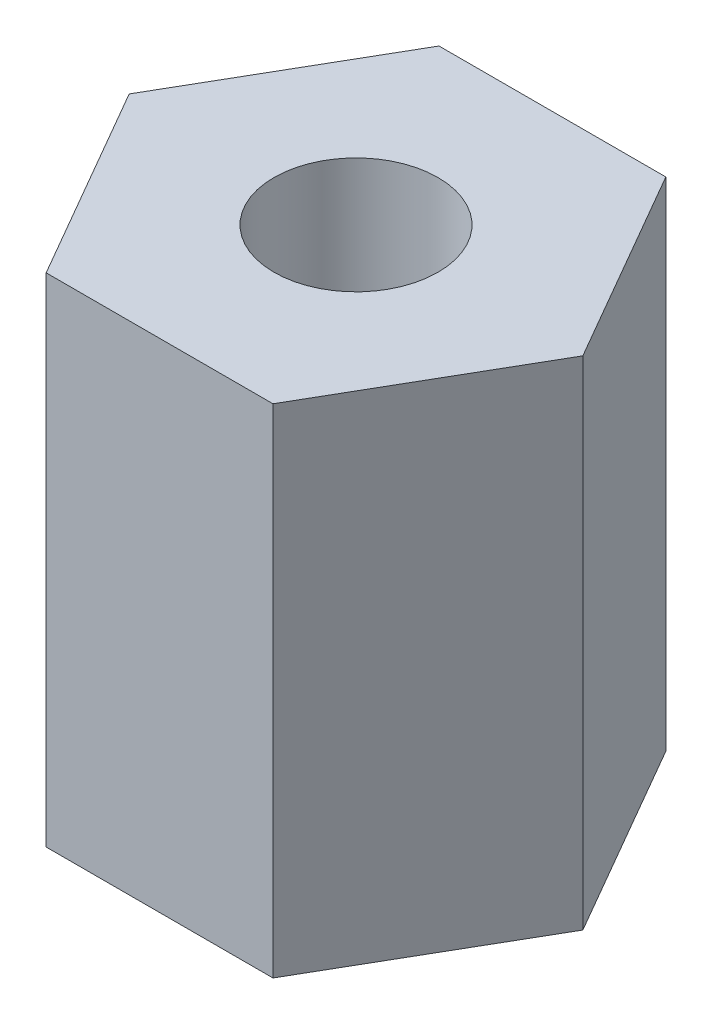
ISO-10303-21;
HEADER;
FILE_DESCRIPTION(('STEP AP214'),'2;1');
FILE_NAME('part.step','',(''),(''),'','','');
FILE_SCHEMA(('AUTOMOTIVE_DESIGN { 1 0 10303 214 1 1 1 1 }'));
ENDSEC;
DATA;
#1=APPLICATION_CONTEXT('core data for automotive mechanical design processes');
#2=APPLICATION_PROTOCOL_DEFINITION('international standard','automotive_design',2000,#1);
#3=PRODUCT_CONTEXT('',#1,'mechanical');
#4=PRODUCT('Part','Part','',(#3));
#5=PRODUCT_RELATED_PRODUCT_CATEGORY('part','',(#4));
#6=PRODUCT_DEFINITION_FORMATION('','',#4);
#7=PRODUCT_DEFINITION_CONTEXT('part definition',#1,'design');
#8=PRODUCT_DEFINITION('design','',#6,#7);
#9=PRODUCT_DEFINITION_SHAPE('','',#8);
#10=(LENGTH_UNIT() NAMED_UNIT(*) SI_UNIT(.MILLI.,.METRE.));
#11=(NAMED_UNIT(*) PLANE_ANGLE_UNIT() SI_UNIT($,.RADIAN.));
#12=(NAMED_UNIT(*) SI_UNIT($,.STERADIAN.) SOLID_ANGLE_UNIT());
#13=UNCERTAINTY_MEASURE_WITH_UNIT(LENGTH_MEASURE(1.E-05),#10,'distance_accuracy_value','');
#14=(GEOMETRIC_REPRESENTATION_CONTEXT(3) GLOBAL_UNCERTAINTY_ASSIGNED_CONTEXT((#13)) GLOBAL_UNIT_ASSIGNED_CONTEXT((#10,
#11,#12)) REPRESENTATION_CONTEXT('',''));
#15=CARTESIAN_POINT('',(0.,0.,0.));
#16=DIRECTION('',(0.,0.,1.));
#17=DIRECTION('',(1.,0.,0.));
#18=AXIS2_PLACEMENT_3D('',#15,#16,#17);
#19=CARTESIAN_POINT('',(-1.21757597905893,-4.00000000000001,1.11355679478807));
#20=DIRECTION('',(0.,0.,1.));
#21=DIRECTION('',(1.,0.,0.));
#22=AXIS2_PLACEMENT_3D('',#19,#20,#21);
#23=PLANE('',#22);
#24=DIRECTION('',(-1.,0.,0.));
#25=VECTOR('',#24,1.);
#26=CARTESIAN_POINT('',(-1.21757597905893,7.,1.11355679478807));
#27=LINE('',#26,#25);
#28=CARTESIAN_POINT('',(1.21757597905893,7.,1.11355679478807));
#29=VERTEX_POINT('',#28);
#30=CARTESIAN_POINT('',(-1.21757597905893,7.,1.11355679478807));
#31=VERTEX_POINT('',#30);
#32=EDGE_CURVE('E11',#29,#31,#27,.T.);
#33=ORIENTED_EDGE('',*,*,#32,.F.);
#34=DIRECTION('',(0.,1.,0.));
#35=VECTOR('',#34,1.);
#36=CARTESIAN_POINT('',(1.21757597905893,-4.00000000000001,1.11355679478807));
#37=LINE('',#36,#35);
#38=CARTESIAN_POINT('',(1.21757597905893,0.,1.11355679478807));
#39=VERTEX_POINT('',#38);
#40=EDGE_CURVE('E53',#39,#29,#37,.T.);
#41=ORIENTED_EDGE('',*,*,#40,.F.);
#42=DIRECTION('',(1.,0.,0.));
#43=VECTOR('',#42,1.);
#44=CARTESIAN_POINT('',(0.,0.,1.11355679478807));
#45=LINE('',#44,#43);
#46=CARTESIAN_POINT('',(-1.21757597905893,0.,1.11355679478807));
#47=VERTEX_POINT('',#46);
#48=EDGE_CURVE('E104',#47,#39,#45,.T.);
#49=ORIENTED_EDGE('',*,*,#48,.F.);
#50=DIRECTION('',(0.,1.,0.));
#51=VECTOR('',#50,1.);
#52=CARTESIAN_POINT('',(-1.21757597905893,-4.00000000000001,1.11355679478807));
#53=LINE('',#52,#51);
#54=EDGE_CURVE('E99',#47,#31,#53,.T.);
#55=ORIENTED_EDGE('',*,*,#54,.T.);
#56=EDGE_LOOP('',(#33,#41,#49,#55));
#57=FACE_BOUND('',#56,.T.);
#58=ADVANCED_FACE('F33',(#57),#23,.F.);
#59=CARTESIAN_POINT('',(2.28053356329902,10.,3.95));
#60=DIRECTION('',(-0.866025403784439,0.,-0.5));
#61=DIRECTION('',(-0.5,0.,0.866025403784439));
#62=AXIS2_PLACEMENT_3D('',#59,#60,#61);
#63=PLANE('',#62);
#64=DIRECTION('',(0.5,0.,-0.866025403784439));
#65=VECTOR('',#64,1.);
#66=CARTESIAN_POINT('',(2.28053356329902,0.,3.95));
#67=LINE('',#66,#65);
#68=CARTESIAN_POINT('',(2.28053356329902,0.,3.95));
#69=VERTEX_POINT('',#68);
#70=CARTESIAN_POINT('',(4.56106712659804,0.,0.));
#71=VERTEX_POINT('',#70);
#72=EDGE_CURVE('E106',#69,#71,#67,.T.);
#73=ORIENTED_EDGE('',*,*,#72,.T.);
#74=DIRECTION('',(0.,-1.,0.));
#75=VECTOR('',#74,1.);
#76=CARTESIAN_POINT('',(4.56106712659804,10.,0.));
#77=LINE('',#76,#75);
#78=CARTESIAN_POINT('',(4.56106712659804,10.,0.));
#79=VERTEX_POINT('',#78);
#80=EDGE_CURVE('E151',#79,#71,#77,.T.);
#81=ORIENTED_EDGE('',*,*,#80,.F.);
#82=DIRECTION('',(0.5,0.,-0.866025403784439));
#83=VECTOR('',#82,1.);
#84=CARTESIAN_POINT('',(2.28053356329902,10.,3.95));
#85=LINE('',#84,#83);
#86=CARTESIAN_POINT('',(2.28053356329902,10.,3.95));
#87=VERTEX_POINT('',#86);
#88=EDGE_CURVE('E111',#87,#79,#85,.T.);
#89=ORIENTED_EDGE('',*,*,#88,.F.);
#90=DIRECTION('',(0.,-1.,0.));
#91=VECTOR('',#90,1.);
#92=CARTESIAN_POINT('',(2.28053356329902,10.,3.95));
#93=LINE('',#92,#91);
#94=EDGE_CURVE('E125',#87,#69,#93,.T.);
#95=ORIENTED_EDGE('',*,*,#94,.T.);
#96=EDGE_LOOP('',(#73,#81,#89,#95));
#97=FACE_BOUND('',#96,.T.);
#98=ADVANCED_FACE('F35',(#97),#63,.F.);
#99=CARTESIAN_POINT('',(4.56106712659804,10.,0.));
#100=DIRECTION('',(-0.866025403784439,0.,0.5));
#101=DIRECTION('',(0.5,0.,0.866025403784439));
#102=AXIS2_PLACEMENT_3D('',#99,#100,#101);
#103=PLANE('',#102);
#104=DIRECTION('',(-0.5,0.,-0.866025403784439));
#105=VECTOR('',#104,1.);
#106=CARTESIAN_POINT('',(4.56106712659804,0.,0.));
#107=LINE('',#106,#105);
#108=CARTESIAN_POINT('',(2.28053356329901,0.,-3.95000000000001));
#109=VERTEX_POINT('',#108);
#110=EDGE_CURVE('E128',#71,#109,#107,.T.);
#111=ORIENTED_EDGE('',*,*,#110,.T.);
#112=DIRECTION('',(0.,-1.,0.));
#113=VECTOR('',#112,1.);
#114=CARTESIAN_POINT('',(2.28053356329901,10.,-3.95000000000001));
#115=LINE('',#114,#113);
#116=CARTESIAN_POINT('',(2.28053356329901,10.,-3.95000000000001));
#117=VERTEX_POINT('',#116);
#118=EDGE_CURVE('E148',#117,#109,#115,.T.);
#119=ORIENTED_EDGE('',*,*,#118,.F.);
#120=DIRECTION('',(-0.5,0.,-0.866025403784439));
#121=VECTOR('',#120,1.);
#122=CARTESIAN_POINT('',(4.56106712659804,10.,0.));
#123=LINE('',#122,#121);
#124=EDGE_CURVE('E114',#79,#117,#123,.T.);
#125=ORIENTED_EDGE('',*,*,#124,.F.);
#126=ORIENTED_EDGE('',*,*,#80,.T.);
#127=EDGE_LOOP('',(#111,#119,#125,#126));
#128=FACE_BOUND('',#127,.T.);
#129=ADVANCED_FACE('F186',(#128),#103,.F.);
#130=CARTESIAN_POINT('',(2.28053356329901,10.,-3.95000000000001));
#131=DIRECTION('',(0.,0.,1.));
#132=DIRECTION('',(1.,0.,0.));
#133=AXIS2_PLACEMENT_3D('',#130,#131,#132);
#134=PLANE('',#133);
#135=DIRECTION('',(-1.,0.,0.));
#136=VECTOR('',#135,1.);
#137=CARTESIAN_POINT('',(2.28053356329901,0.,-3.95000000000001));
#138=LINE('',#137,#136);
#139=CARTESIAN_POINT('',(-2.28053356329902,0.,-3.95000000000001));
#140=VERTEX_POINT('',#139);
#141=EDGE_CURVE('E130',#109,#140,#138,.T.);
#142=ORIENTED_EDGE('',*,*,#141,.T.);
#143=DIRECTION('',(0.,-1.,0.));
#144=VECTOR('',#143,1.);
#145=CARTESIAN_POINT('',(-2.28053356329902,10.,-3.95000000000001));
#146=LINE('',#145,#144);
#147=CARTESIAN_POINT('',(-2.28053356329902,10.,-3.95000000000001));
#148=VERTEX_POINT('',#147);
#149=EDGE_CURVE('E145',#148,#140,#146,.T.);
#150=ORIENTED_EDGE('',*,*,#149,.F.);
#151=DIRECTION('',(-1.,0.,0.));
#152=VECTOR('',#151,1.);
#153=CARTESIAN_POINT('',(2.28053356329901,10.,-3.95000000000001));
#154=LINE('',#153,#152);
#155=EDGE_CURVE('E117',#117,#148,#154,.T.);
#156=ORIENTED_EDGE('',*,*,#155,.F.);
#157=ORIENTED_EDGE('',*,*,#118,.T.);
#158=EDGE_LOOP('',(#142,#150,#156,#157));
#159=FACE_BOUND('',#158,.T.);
#160=ADVANCED_FACE('F183',(#159),#134,.F.);
#161=CARTESIAN_POINT('',(-2.28053356329902,10.,-3.95000000000001));
#162=DIRECTION('',(0.866025403784439,0.,0.5));
#163=DIRECTION('',(0.5,0.,-0.866025403784439));
#164=AXIS2_PLACEMENT_3D('',#161,#162,#163);
#165=PLANE('',#164);
#166=DIRECTION('',(-0.5,0.,0.866025403784439));
#167=VECTOR('',#166,1.);
#168=CARTESIAN_POINT('',(-2.28053356329902,0.,-3.95000000000001));
#169=LINE('',#168,#167);
#170=CARTESIAN_POINT('',(-4.56106712659805,0.,0.));
#171=VERTEX_POINT('',#170);
#172=EDGE_CURVE('E132',#140,#171,#169,.T.);
#173=ORIENTED_EDGE('',*,*,#172,.T.);
#174=DIRECTION('',(0.,-1.,0.));
#175=VECTOR('',#174,1.);
#176=CARTESIAN_POINT('',(-4.56106712659805,10.,0.));
#177=LINE('',#176,#175);
#178=CARTESIAN_POINT('',(-4.56106712659805,10.,0.));
#179=VERTEX_POINT('',#178);
#180=EDGE_CURVE('E142',#179,#171,#177,.T.);
#181=ORIENTED_EDGE('',*,*,#180,.F.);
#182=DIRECTION('',(-0.5,0.,0.866025403784439));
#183=VECTOR('',#182,1.);
#184=CARTESIAN_POINT('',(-2.28053356329902,10.,-3.95000000000001));
#185=LINE('',#184,#183);
#186=EDGE_CURVE('E119',#148,#179,#185,.T.);
#187=ORIENTED_EDGE('',*,*,#186,.F.);
#188=ORIENTED_EDGE('',*,*,#149,.T.);
#189=EDGE_LOOP('',(#173,#181,#187,#188));
#190=FACE_BOUND('',#189,.T.);
#191=ADVANCED_FACE('F178',(#190),#165,.F.);
#192=CARTESIAN_POINT('',(-4.56106712659805,10.,0.));
#193=DIRECTION('',(0.866025403784439,0.,-0.5));
#194=DIRECTION('',(-0.5,0.,-0.866025403784439));
#195=AXIS2_PLACEMENT_3D('',#192,#193,#194);
#196=PLANE('',#195);
#197=DIRECTION('',(0.5,0.,0.866025403784439));
#198=VECTOR('',#197,1.);
#199=CARTESIAN_POINT('',(-4.56106712659805,0.,0.));
#200=LINE('',#199,#198);
#201=CARTESIAN_POINT('',(-2.28053356329902,0.,3.95));
#202=VERTEX_POINT('',#201);
#203=EDGE_CURVE('E134',#171,#202,#200,.T.);
#204=ORIENTED_EDGE('',*,*,#203,.T.);
#205=DIRECTION('',(0.,-1.,0.));
#206=VECTOR('',#205,1.);
#207=CARTESIAN_POINT('',(-2.28053356329902,10.,3.95));
#208=LINE('',#207,#206);
#209=CARTESIAN_POINT('',(-2.28053356329902,10.,3.95));
#210=VERTEX_POINT('',#209);
#211=EDGE_CURVE('E139',#210,#202,#208,.T.);
#212=ORIENTED_EDGE('',*,*,#211,.F.);
#213=DIRECTION('',(0.5,0.,0.866025403784439));
#214=VECTOR('',#213,1.);
#215=CARTESIAN_POINT('',(-4.56106712659805,10.,0.));
#216=LINE('',#215,#214);
#217=EDGE_CURVE('E121',#179,#210,#216,.T.);
#218=ORIENTED_EDGE('',*,*,#217,.F.);
#219=ORIENTED_EDGE('',*,*,#180,.T.);
#220=EDGE_LOOP('',(#204,#212,#218,#219));
#221=FACE_BOUND('',#220,.T.);
#222=ADVANCED_FACE('F174',(#221),#196,.F.);
#223=CARTESIAN_POINT('',(-2.28053356329902,10.,3.95));
#224=DIRECTION('',(0.,0.,-1.));
#225=DIRECTION('',(-1.,0.,0.));
#226=AXIS2_PLACEMENT_3D('',#223,#224,#225);
#227=PLANE('',#226);
#228=DIRECTION('',(1.,0.,0.));
#229=VECTOR('',#228,1.);
#230=CARTESIAN_POINT('',(-2.28053356329902,0.,3.95));
#231=LINE('',#230,#229);
#232=EDGE_CURVE('E115',#202,#69,#231,.T.);
#233=ORIENTED_EDGE('',*,*,#232,.T.);
#234=ORIENTED_EDGE('',*,*,#94,.F.);
#235=DIRECTION('',(1.,0.,0.));
#236=VECTOR('',#235,1.);
#237=CARTESIAN_POINT('',(-2.28053356329902,10.,3.95));
#238=LINE('',#237,#236);
#239=EDGE_CURVE('E123',#210,#87,#238,.T.);
#240=ORIENTED_EDGE('',*,*,#239,.F.);
#241=ORIENTED_EDGE('',*,*,#211,.T.);
#242=EDGE_LOOP('',(#233,#234,#240,#241));
#243=FACE_BOUND('',#242,.T.);
#244=ADVANCED_FACE('F170',(#243),#227,.F.);
#245=CARTESIAN_POINT('',(0.,10.,0.));
#246=DIRECTION('',(0.,1.,0.));
#247=DIRECTION('',(0.,0.,1.));
#248=AXIS2_PLACEMENT_3D('',#245,#246,#247);
#249=PLANE('',#248);
#250=CARTESIAN_POINT('',(0.,10.,0.));
#251=DIRECTION('',(0.,1.,0.));
#252=DIRECTION('',(0.,0.,-1.));
#253=AXIS2_PLACEMENT_3D('',#250,#251,#252);
#254=CIRCLE('',#253,1.65);
#255=CARTESIAN_POINT('',(0.,10.,-1.65));
#256=VERTEX_POINT('',#255);
#257=EDGE_CURVE('E101',#256,#256,#254,.T.);
#258=ORIENTED_EDGE('',*,*,#257,.F.);
#259=EDGE_LOOP('',(#258));
#260=FACE_BOUND('',#259,.T.);
#261=ORIENTED_EDGE('',*,*,#88,.T.);
#262=ORIENTED_EDGE('',*,*,#124,.T.);
#263=ORIENTED_EDGE('',*,*,#155,.T.);
#264=ORIENTED_EDGE('',*,*,#186,.T.);
#265=ORIENTED_EDGE('',*,*,#217,.T.);
#266=ORIENTED_EDGE('',*,*,#239,.T.);
#267=EDGE_LOOP('',(#261,#262,#263,#264,#265,#266));
#268=FACE_BOUND('',#267,.T.);
#269=ADVANCED_FACE('F158',(#260,#268),#249,.T.);
#270=CARTESIAN_POINT('',(0.,0.,0.));
#271=DIRECTION('',(0.,1.,0.));
#272=DIRECTION('',(0.,0.,1.));
#273=AXIS2_PLACEMENT_3D('',#270,#271,#272);
#274=PLANE('',#273);
#275=ORIENTED_EDGE('',*,*,#48,.T.);
#276=CARTESIAN_POINT('',(0.,0.,0.));
#277=DIRECTION('',(0.,1.,0.));
#278=DIRECTION('',(0.,0.,1.));
#279=AXIS2_PLACEMENT_3D('',#276,#277,#278);
#280=CIRCLE('',#279,1.65);
#281=EDGE_CURVE('E41',#39,#47,#280,.T.);
#282=ORIENTED_EDGE('',*,*,#281,.T.);
#283=EDGE_LOOP('',(#275,#282));
#284=FACE_BOUND('',#283,.T.);
#285=ORIENTED_EDGE('',*,*,#72,.F.);
#286=ORIENTED_EDGE('',*,*,#232,.F.);
#287=ORIENTED_EDGE('',*,*,#203,.F.);
#288=ORIENTED_EDGE('',*,*,#172,.F.);
#289=ORIENTED_EDGE('',*,*,#141,.F.);
#290=ORIENTED_EDGE('',*,*,#110,.F.);
#291=EDGE_LOOP('',(#285,#286,#287,#288,#289,#290));
#292=FACE_BOUND('',#291,.T.);
#293=ADVANCED_FACE('F155',(#284,#292),#274,.F.);
#294=CARTESIAN_POINT('',(0.,-4.00000000000001,0.));
#295=DIRECTION('',(0.,1.,0.));
#296=DIRECTION('',(0.,0.,1.));
#297=AXIS2_PLACEMENT_3D('',#294,#295,#296);
#298=CYLINDRICAL_SURFACE('',#297,1.65);
#299=ORIENTED_EDGE('',*,*,#257,.T.);
#300=EDGE_LOOP('',(#299));
#301=FACE_BOUND('',#300,.T.);
#302=CARTESIAN_POINT('',(0.,7.,0.));
#303=DIRECTION('',(0.,1.,0.));
#304=DIRECTION('',(0.,0.,1.));
#305=AXIS2_PLACEMENT_3D('',#302,#303,#304);
#306=CIRCLE('',#305,1.65);
#307=EDGE_CURVE('E46',#31,#29,#306,.T.);
#308=ORIENTED_EDGE('',*,*,#307,.F.);
#309=ORIENTED_EDGE('',*,*,#54,.F.);
#310=ORIENTED_EDGE('',*,*,#281,.F.);
#311=ORIENTED_EDGE('',*,*,#40,.T.);
#312=EDGE_LOOP('',(#308,#309,#310,#311));
#313=FACE_BOUND('',#312,.T.);
#314=ADVANCED_FACE('F98',(#301,#313),#298,.F.);
#315=CARTESIAN_POINT('',(0.,7.,0.));
#316=DIRECTION('',(0.,1.,0.));
#317=DIRECTION('',(0.,0.,1.));
#318=AXIS2_PLACEMENT_3D('',#315,#316,#317);
#319=PLANE('',#318);
#320=ORIENTED_EDGE('',*,*,#32,.T.);
#321=ORIENTED_EDGE('',*,*,#307,.T.);
#322=EDGE_LOOP('',(#320,#321));
#323=FACE_BOUND('',#322,.T.);
#324=ADVANCED_FACE('F94',(#323),#319,.T.);
#325=CLOSED_SHELL('',(#58,#98,#129,#160,#191,#222,#244,#269,#293,#314,#324));
#326=MANIFOLD_SOLID_BREP('B2',#325);
#327=ADVANCED_BREP_SHAPE_REPRESENTATION('',(#18,#326),#14);
#328=SHAPE_DEFINITION_REPRESENTATION(#9,#327);
ENDSEC;
END-ISO-10303-21;
